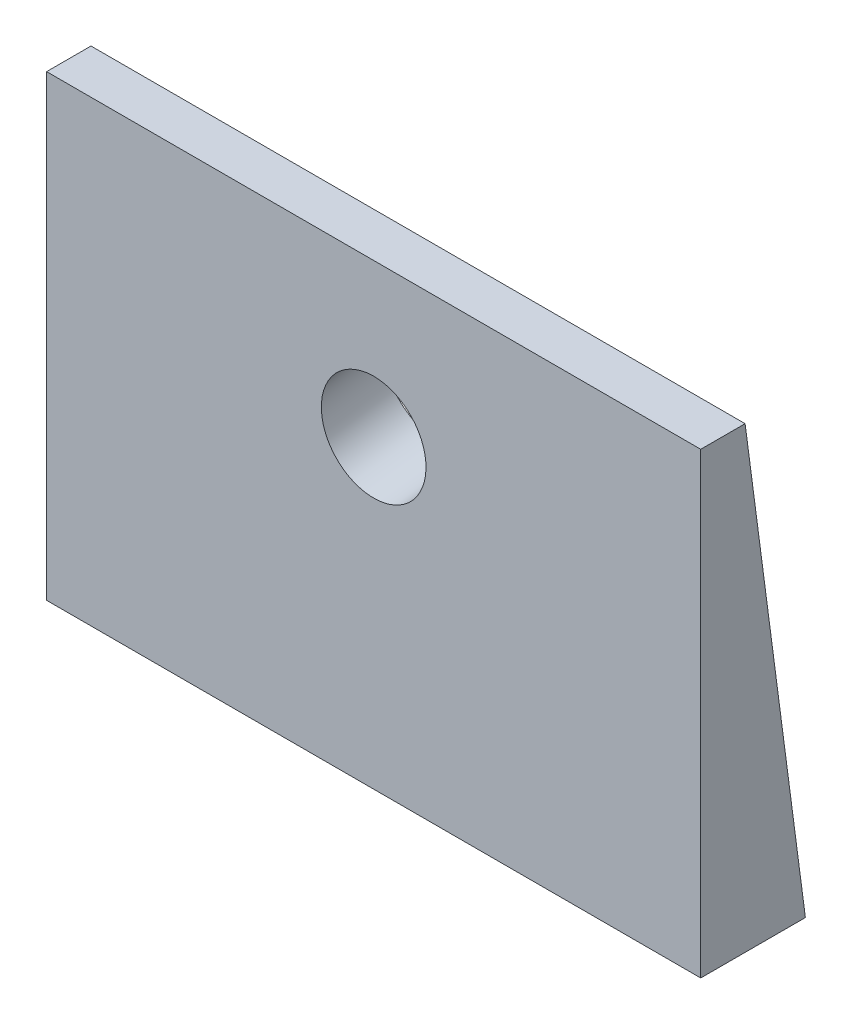
ISO-10303-21;
HEADER;
FILE_DESCRIPTION(('STEP AP214'),'2;1');
FILE_NAME('part.step','',(''),(''),'','','');
FILE_SCHEMA(('AUTOMOTIVE_DESIGN { 1 0 10303 214 1 1 1 1 }'));
ENDSEC;
DATA;
#1=APPLICATION_CONTEXT('core data for automotive mechanical design processes');
#2=APPLICATION_PROTOCOL_DEFINITION('international standard','automotive_design',2000,#1);
#3=PRODUCT_CONTEXT('',#1,'mechanical');
#4=PRODUCT('Part','Part','',(#3));
#5=PRODUCT_RELATED_PRODUCT_CATEGORY('part','',(#4));
#6=PRODUCT_DEFINITION_FORMATION('','',#4);
#7=PRODUCT_DEFINITION_CONTEXT('part definition',#1,'design');
#8=PRODUCT_DEFINITION('design','',#6,#7);
#9=PRODUCT_DEFINITION_SHAPE('','',#8);
#10=(LENGTH_UNIT() NAMED_UNIT(*) SI_UNIT(.MILLI.,.METRE.));
#11=(NAMED_UNIT(*) PLANE_ANGLE_UNIT() SI_UNIT($,.RADIAN.));
#12=(NAMED_UNIT(*) SI_UNIT($,.STERADIAN.) SOLID_ANGLE_UNIT());
#13=UNCERTAINTY_MEASURE_WITH_UNIT(LENGTH_MEASURE(1.E-05),#10,'distance_accuracy_value','');
#14=(GEOMETRIC_REPRESENTATION_CONTEXT(3) GLOBAL_UNCERTAINTY_ASSIGNED_CONTEXT((#13)) GLOBAL_UNIT_ASSIGNED_CONTEXT((#10,
#11,#12)) REPRESENTATION_CONTEXT('',''));
#15=CARTESIAN_POINT('',(0.,0.,0.));
#16=DIRECTION('',(0.,0.,1.));
#17=DIRECTION('',(1.,0.,0.));
#18=AXIS2_PLACEMENT_3D('',#15,#16,#17);
#19=CARTESIAN_POINT('',(125.,181.47,23.0391870777951));
#20=DIRECTION('',(0.,-0.130526192220056,0.99144486137381));
#21=DIRECTION('',(0.,-0.99144486137381,-0.130526192220056));
#22=AXIS2_PLACEMENT_3D('',#19,#20,#21);
#23=PLANE('',#22);
#24=CARTESIAN_POINT('',(0.,126.182358524249,15.7604309917956));
#25=DIRECTION('',(0.,-0.130526192220056,0.99144486137381));
#26=DIRECTION('',(0.,-0.99144486137381,-0.130526192220056));
#27=AXIS2_PLACEMENT_3D('',#24,#25,#26);
#28=CIRCLE('',#27,20.);
#29=CARTESIAN_POINT('',(0.,106.353461296772,13.1499071473945));
#30=VERTEX_POINT('',#29);
#31=EDGE_CURVE('E105',#30,#30,#28,.T.);
#32=ORIENTED_EDGE('',*,*,#31,.T.);
#33=EDGE_LOOP('',(#32));
#34=FACE_BOUND('',#33,.T.);
#35=DIRECTION('',(0.,0.99144486137381,0.130526192220056));
#36=VECTOR('',#35,1.);
#37=CARTESIAN_POINT('',(-125.,181.47,23.0391870777951));
#38=LINE('',#37,#36);
#39=CARTESIAN_POINT('',(-125.,6.47,0.));
#40=VERTEX_POINT('',#39);
#41=CARTESIAN_POINT('',(-125.,181.47,23.0391870777951));
#42=VERTEX_POINT('',#41);
#43=EDGE_CURVE('E102',#40,#42,#38,.T.);
#44=ORIENTED_EDGE('',*,*,#43,.T.);
#45=DIRECTION('',(-1.,0.,0.));
#46=VECTOR('',#45,1.);
#47=CARTESIAN_POINT('',(125.,181.47,23.0391870777951));
#48=LINE('',#47,#46);
#49=CARTESIAN_POINT('',(125.,181.47,23.0391870777951));
#50=VERTEX_POINT('',#49);
#51=EDGE_CURVE('E11',#50,#42,#48,.T.);
#52=ORIENTED_EDGE('',*,*,#51,.F.);
#53=DIRECTION('',(0.,0.99144486137381,0.130526192220056));
#54=VECTOR('',#53,1.);
#55=CARTESIAN_POINT('',(125.,181.47,23.0391870777951));
#56=LINE('',#55,#54);
#57=CARTESIAN_POINT('',(125.,6.47,0.));
#58=VERTEX_POINT('',#57);
#59=EDGE_CURVE('E89',#58,#50,#56,.T.);
#60=ORIENTED_EDGE('',*,*,#59,.F.);
#61=DIRECTION('',(-1.,0.,0.));
#62=VECTOR('',#61,1.);
#63=CARTESIAN_POINT('',(125.,6.47,0.));
#64=LINE('',#63,#62);
#65=EDGE_CURVE('E98',#58,#40,#64,.T.);
#66=ORIENTED_EDGE('',*,*,#65,.T.);
#67=EDGE_LOOP('',(#44,#52,#60,#66));
#68=FACE_BOUND('',#67,.T.);
#69=ADVANCED_FACE('F37',(#34,#68),#23,.F.);
#70=CARTESIAN_POINT('',(125.,181.47,40.));
#71=DIRECTION('',(0.,-1.,0.));
#72=DIRECTION('',(0.,0.,-1.));
#73=AXIS2_PLACEMENT_3D('',#70,#71,#72);
#74=PLANE('',#73);
#75=DIRECTION('',(0.,0.,1.));
#76=VECTOR('',#75,1.);
#77=CARTESIAN_POINT('',(-125.,181.47,40.));
#78=LINE('',#77,#76);
#79=CARTESIAN_POINT('',(-125.,181.47,40.));
#80=VERTEX_POINT('',#79);
#81=EDGE_CURVE('E93',#42,#80,#78,.T.);
#82=ORIENTED_EDGE('',*,*,#81,.T.);
#83=DIRECTION('',(-1.,0.,0.));
#84=VECTOR('',#83,1.);
#85=CARTESIAN_POINT('',(125.,181.47,40.));
#86=LINE('',#85,#84);
#87=CARTESIAN_POINT('',(125.,181.47,40.));
#88=VERTEX_POINT('',#87);
#89=EDGE_CURVE('E46',#88,#80,#86,.T.);
#90=ORIENTED_EDGE('',*,*,#89,.F.);
#91=DIRECTION('',(0.,0.,1.));
#92=VECTOR('',#91,1.);
#93=CARTESIAN_POINT('',(125.,181.47,40.));
#94=LINE('',#93,#92);
#95=EDGE_CURVE('E84',#50,#88,#94,.T.);
#96=ORIENTED_EDGE('',*,*,#95,.F.);
#97=ORIENTED_EDGE('',*,*,#51,.T.);
#98=EDGE_LOOP('',(#82,#90,#96,#97));
#99=FACE_BOUND('',#98,.T.);
#100=ADVANCED_FACE('F92',(#99),#74,.F.);
#101=CARTESIAN_POINT('',(125.,6.46999999999999,40.));
#102=DIRECTION('',(0.,0.,-1.));
#103=DIRECTION('',(-1.,0.,0.));
#104=AXIS2_PLACEMENT_3D('',#101,#102,#103);
#105=PLANE('',#104);
#106=CARTESIAN_POINT('',(0.,122.991158723876,40.));
#107=DIRECTION('',(0.,0.,-1.));
#108=DIRECTION('',(0.,1.,0.));
#109=AXIS2_PLACEMENT_3D('',#106,#107,#108);
#110=ELLIPSE('',#109,20.1725792116031,20.);
#111=CARTESIAN_POINT('',(0.,143.163737935479,40.));
#112=VERTEX_POINT('',#111);
#113=EDGE_CURVE('E40',#112,#112,#110,.T.);
#114=ORIENTED_EDGE('',*,*,#113,.T.);
#115=EDGE_LOOP('',(#114));
#116=FACE_BOUND('',#115,.T.);
#117=DIRECTION('',(0.,-1.,0.));
#118=VECTOR('',#117,1.);
#119=CARTESIAN_POINT('',(-125.,6.46999999999999,40.));
#120=LINE('',#119,#118);
#121=CARTESIAN_POINT('',(-125.,6.46999999999999,40.));
#122=VERTEX_POINT('',#121);
#123=EDGE_CURVE('E71',#80,#122,#120,.T.);
#124=ORIENTED_EDGE('',*,*,#123,.T.);
#125=DIRECTION('',(-1.,0.,0.));
#126=VECTOR('',#125,1.);
#127=CARTESIAN_POINT('',(125.,6.46999999999999,40.));
#128=LINE('',#127,#126);
#129=CARTESIAN_POINT('',(125.,6.46999999999999,40.));
#130=VERTEX_POINT('',#129);
#131=EDGE_CURVE('E94',#130,#122,#128,.T.);
#132=ORIENTED_EDGE('',*,*,#131,.F.);
#133=DIRECTION('',(0.,-1.,0.));
#134=VECTOR('',#133,1.);
#135=CARTESIAN_POINT('',(125.,6.46999999999999,40.));
#136=LINE('',#135,#134);
#137=EDGE_CURVE('E87',#88,#130,#136,.T.);
#138=ORIENTED_EDGE('',*,*,#137,.F.);
#139=ORIENTED_EDGE('',*,*,#89,.T.);
#140=EDGE_LOOP('',(#124,#132,#138,#139));
#141=FACE_BOUND('',#140,.T.);
#142=ADVANCED_FACE('F96',(#116,#141),#105,.F.);
#143=CARTESIAN_POINT('',(125.,6.47,0.));
#144=DIRECTION('',(0.,1.,0.));
#145=DIRECTION('',(0.,0.,1.));
#146=AXIS2_PLACEMENT_3D('',#143,#144,#145);
#147=PLANE('',#146);
#148=DIRECTION('',(0.,0.,-1.));
#149=VECTOR('',#148,1.);
#150=CARTESIAN_POINT('',(-125.,6.47,0.));
#151=LINE('',#150,#149);
#152=EDGE_CURVE('E77',#122,#40,#151,.T.);
#153=ORIENTED_EDGE('',*,*,#152,.T.);
#154=ORIENTED_EDGE('',*,*,#65,.F.);
#155=DIRECTION('',(0.,0.,-1.));
#156=VECTOR('',#155,1.);
#157=CARTESIAN_POINT('',(125.,6.47,0.));
#158=LINE('',#157,#156);
#159=EDGE_CURVE('E54',#130,#58,#158,.T.);
#160=ORIENTED_EDGE('',*,*,#159,.F.);
#161=ORIENTED_EDGE('',*,*,#131,.T.);
#162=EDGE_LOOP('',(#153,#154,#160,#161));
#163=FACE_BOUND('',#162,.T.);
#164=ADVANCED_FACE('F110',(#163),#147,.F.);
#165=CARTESIAN_POINT('',(125.,0.,0.));
#166=DIRECTION('',(-1.,0.,0.));
#167=DIRECTION('',(0.,0.,1.));
#168=AXIS2_PLACEMENT_3D('',#165,#166,#167);
#169=PLANE('',#168);
#170=ORIENTED_EDGE('',*,*,#59,.T.);
#171=ORIENTED_EDGE('',*,*,#95,.T.);
#172=ORIENTED_EDGE('',*,*,#137,.T.);
#173=ORIENTED_EDGE('',*,*,#159,.T.);
#174=EDGE_LOOP('',(#170,#171,#172,#173));
#175=FACE_BOUND('',#174,.T.);
#176=ADVANCED_FACE('F85',(#175),#169,.F.);
#177=CARTESIAN_POINT('',(-125.,0.,0.));
#178=DIRECTION('',(-1.,0.,0.));
#179=DIRECTION('',(0.,0.,1.));
#180=AXIS2_PLACEMENT_3D('',#177,#178,#179);
#181=PLANE('',#180);
#182=ORIENTED_EDGE('',*,*,#43,.F.);
#183=ORIENTED_EDGE('',*,*,#152,.F.);
#184=ORIENTED_EDGE('',*,*,#123,.F.);
#185=ORIENTED_EDGE('',*,*,#81,.F.);
#186=EDGE_LOOP('',(#182,#183,#184,#185));
#187=FACE_BOUND('',#186,.T.);
#188=ADVANCED_FACE('F113',(#187),#181,.T.);
#189=CARTESIAN_POINT('',(0.,121.005977622198,55.078947517577));
#190=DIRECTION('',(0.,0.130526192220056,-0.99144486137381));
#191=DIRECTION('',(0.,0.99144486137381,0.130526192220056));
#192=AXIS2_PLACEMENT_3D('',#189,#190,#191);
#193=CYLINDRICAL_SURFACE('',#192,20.);
#194=ORIENTED_EDGE('',*,*,#113,.F.);
#195=EDGE_LOOP('',(#194));
#196=FACE_BOUND('',#195,.T.);
#197=ORIENTED_EDGE('',*,*,#31,.F.);
#198=EDGE_LOOP('',(#197));
#199=FACE_BOUND('',#198,.T.);
#200=ADVANCED_FACE('F123',(#196,#199),#193,.F.);
#201=CLOSED_SHELL('',(#69,#100,#142,#164,#176,#188,#200));
#202=MANIFOLD_SOLID_BREP('B2',#201);
#203=ADVANCED_BREP_SHAPE_REPRESENTATION('',(#18,#202),#14);
#204=SHAPE_DEFINITION_REPRESENTATION(#9,#203);
ENDSEC;
END-ISO-10303-21;
